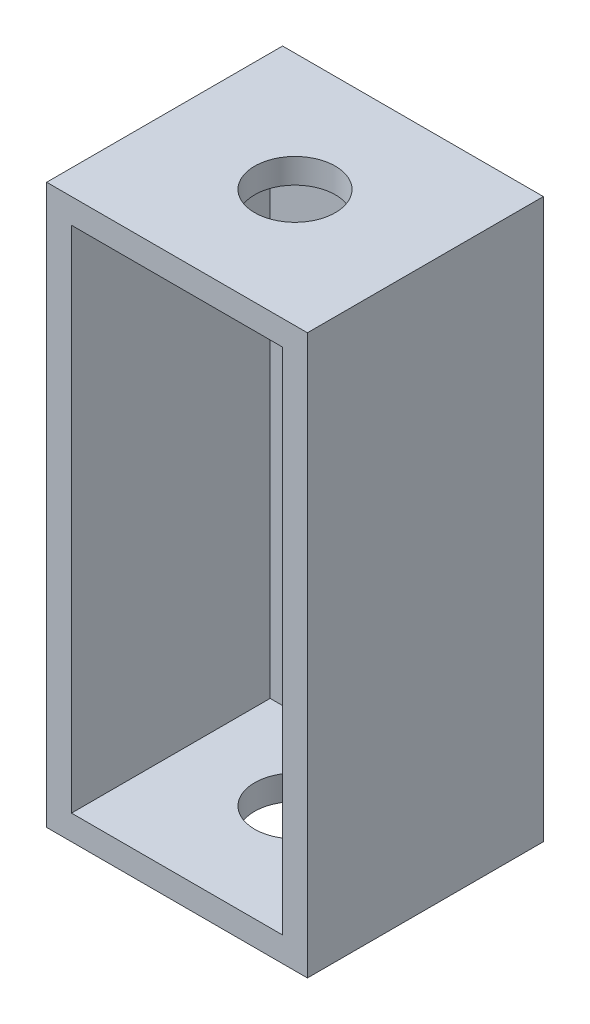
ISO-10303-21;
HEADER;
FILE_DESCRIPTION(('STEP AP214'),'2;1');
FILE_NAME('part.step','',(''),(''),'','','');
FILE_SCHEMA(('AUTOMOTIVE_DESIGN { 1 0 10303 214 1 1 1 1 }'));
ENDSEC;
DATA;
#1=APPLICATION_CONTEXT('core data for automotive mechanical design processes');
#2=APPLICATION_PROTOCOL_DEFINITION('international standard','automotive_design',2000,#1);
#3=PRODUCT_CONTEXT('',#1,'mechanical');
#4=PRODUCT('Part','Part','',(#3));
#5=PRODUCT_RELATED_PRODUCT_CATEGORY('part','',(#4));
#6=PRODUCT_DEFINITION_FORMATION('','',#4);
#7=PRODUCT_DEFINITION_CONTEXT('part definition',#1,'design');
#8=PRODUCT_DEFINITION('design','',#6,#7);
#9=PRODUCT_DEFINITION_SHAPE('','',#8);
#10=(LENGTH_UNIT() NAMED_UNIT(*) SI_UNIT(.MILLI.,.METRE.));
#11=(NAMED_UNIT(*) PLANE_ANGLE_UNIT() SI_UNIT($,.RADIAN.));
#12=(NAMED_UNIT(*) SI_UNIT($,.STERADIAN.) SOLID_ANGLE_UNIT());
#13=UNCERTAINTY_MEASURE_WITH_UNIT(LENGTH_MEASURE(1.E-05),#10,'distance_accuracy_value','');
#14=(GEOMETRIC_REPRESENTATION_CONTEXT(3) GLOBAL_UNCERTAINTY_ASSIGNED_CONTEXT((#13)) GLOBAL_UNIT_ASSIGNED_CONTEXT((#10,
#11,#12)) REPRESENTATION_CONTEXT('',''));
#15=CARTESIAN_POINT('',(0.,0.,0.));
#16=DIRECTION('',(0.,0.,1.));
#17=DIRECTION('',(1.,0.,0.));
#18=AXIS2_PLACEMENT_3D('',#15,#16,#17);
#19=CARTESIAN_POINT('',(0.,90.,38.));
#20=DIRECTION('',(1.,0.,0.));
#21=DIRECTION('',(0.,0.,-1.));
#22=AXIS2_PLACEMENT_3D('',#19,#20,#21);
#23=PLANE('',#22);
#24=DIRECTION('',(0.,-1.,0.));
#25=VECTOR('',#24,1.);
#26=CARTESIAN_POINT('',(0.,90.,0.));
#27=LINE('',#26,#25);
#28=CARTESIAN_POINT('',(0.,90.,0.));
#29=VERTEX_POINT('',#28);
#30=CARTESIAN_POINT('',(0.,0.,0.));
#31=VERTEX_POINT('',#30);
#32=EDGE_CURVE('E151',#29,#31,#27,.T.);
#33=ORIENTED_EDGE('',*,*,#32,.T.);
#34=DIRECTION('',(0.,0.,-1.));
#35=VECTOR('',#34,1.);
#36=CARTESIAN_POINT('',(0.,0.,38.));
#37=LINE('',#36,#35);
#38=CARTESIAN_POINT('',(0.,0.,38.));
#39=VERTEX_POINT('',#38);
#40=EDGE_CURVE('E11',#39,#31,#37,.T.);
#41=ORIENTED_EDGE('',*,*,#40,.F.);
#42=DIRECTION('',(0.,-1.,0.));
#43=VECTOR('',#42,1.);
#44=CARTESIAN_POINT('',(0.,90.,38.));
#45=LINE('',#44,#43);
#46=CARTESIAN_POINT('',(0.,90.,38.));
#47=VERTEX_POINT('',#46);
#48=EDGE_CURVE('E155',#47,#39,#45,.T.);
#49=ORIENTED_EDGE('',*,*,#48,.F.);
#50=DIRECTION('',(0.,0.,-1.));
#51=VECTOR('',#50,1.);
#52=CARTESIAN_POINT('',(0.,90.,38.));
#53=LINE('',#52,#51);
#54=EDGE_CURVE('E161',#47,#29,#53,.T.);
#55=ORIENTED_EDGE('',*,*,#54,.T.);
#56=EDGE_LOOP('',(#33,#41,#49,#55));
#57=FACE_BOUND('',#56,.T.);
#58=ADVANCED_FACE('F39',(#57),#23,.F.);
#59=CARTESIAN_POINT('',(0.,0.,38.));
#60=DIRECTION('',(0.,1.,0.));
#61=DIRECTION('',(0.,0.,1.));
#62=AXIS2_PLACEMENT_3D('',#59,#60,#61);
#63=PLANE('',#62);
#64=CARTESIAN_POINT('',(21.,0.,19.));
#65=DIRECTION('',(0.,1.,0.));
#66=DIRECTION('',(0.,0.,1.));
#67=AXIS2_PLACEMENT_3D('',#64,#65,#66);
#68=CIRCLE('',#67,6.5);
#69=CARTESIAN_POINT('',(21.,0.,25.5));
#70=VERTEX_POINT('',#69);
#71=EDGE_CURVE('E208',#70,#70,#68,.T.);
#72=ORIENTED_EDGE('',*,*,#71,.T.);
#73=EDGE_LOOP('',(#72));
#74=FACE_BOUND('',#73,.T.);
#75=DIRECTION('',(1.,0.,0.));
#76=VECTOR('',#75,1.);
#77=CARTESIAN_POINT('',(0.,0.,0.));
#78=LINE('',#77,#76);
#79=CARTESIAN_POINT('',(42.,0.,0.));
#80=VERTEX_POINT('',#79);
#81=EDGE_CURVE('E164',#31,#80,#78,.T.);
#82=ORIENTED_EDGE('',*,*,#81,.T.);
#83=DIRECTION('',(0.,0.,-1.));
#84=VECTOR('',#83,1.);
#85=CARTESIAN_POINT('',(42.,0.,38.));
#86=LINE('',#85,#84);
#87=CARTESIAN_POINT('',(42.,0.,38.));
#88=VERTEX_POINT('',#87);
#89=EDGE_CURVE('E47',#88,#80,#86,.T.);
#90=ORIENTED_EDGE('',*,*,#89,.F.);
#91=DIRECTION('',(1.,0.,0.));
#92=VECTOR('',#91,1.);
#93=CARTESIAN_POINT('',(0.,0.,38.));
#94=LINE('',#93,#92);
#95=EDGE_CURVE('E91',#39,#88,#94,.T.);
#96=ORIENTED_EDGE('',*,*,#95,.F.);
#97=ORIENTED_EDGE('',*,*,#40,.T.);
#98=EDGE_LOOP('',(#82,#90,#96,#97));
#99=FACE_BOUND('',#98,.T.);
#100=ADVANCED_FACE('F195',(#74,#99),#63,.F.);
#101=CARTESIAN_POINT('',(42.,0.,38.));
#102=DIRECTION('',(-1.,0.,0.));
#103=DIRECTION('',(0.,0.,1.));
#104=AXIS2_PLACEMENT_3D('',#101,#102,#103);
#105=PLANE('',#104);
#106=DIRECTION('',(0.,1.,0.));
#107=VECTOR('',#106,1.);
#108=CARTESIAN_POINT('',(42.,0.,0.));
#109=LINE('',#108,#107);
#110=CARTESIAN_POINT('',(42.,90.,0.));
#111=VERTEX_POINT('',#110);
#112=EDGE_CURVE('E166',#80,#111,#109,.T.);
#113=ORIENTED_EDGE('',*,*,#112,.T.);
#114=DIRECTION('',(0.,0.,-1.));
#115=VECTOR('',#114,1.);
#116=CARTESIAN_POINT('',(42.,90.,38.));
#117=LINE('',#116,#115);
#118=CARTESIAN_POINT('',(42.,90.,38.));
#119=VERTEX_POINT('',#118);
#120=EDGE_CURVE('E170',#119,#111,#117,.T.);
#121=ORIENTED_EDGE('',*,*,#120,.F.);
#122=DIRECTION('',(0.,1.,0.));
#123=VECTOR('',#122,1.);
#124=CARTESIAN_POINT('',(42.,0.,38.));
#125=LINE('',#124,#123);
#126=EDGE_CURVE('E158',#88,#119,#125,.T.);
#127=ORIENTED_EDGE('',*,*,#126,.F.);
#128=ORIENTED_EDGE('',*,*,#89,.T.);
#129=EDGE_LOOP('',(#113,#121,#127,#128));
#130=FACE_BOUND('',#129,.T.);
#131=ADVANCED_FACE('F176',(#130),#105,.F.);
#132=CARTESIAN_POINT('',(42.,90.,38.));
#133=DIRECTION('',(0.,-1.,0.));
#134=DIRECTION('',(0.,0.,-1.));
#135=AXIS2_PLACEMENT_3D('',#132,#133,#134);
#136=PLANE('',#135);
#137=CARTESIAN_POINT('',(21.,90.,19.));
#138=DIRECTION('',(0.,1.,0.));
#139=DIRECTION('',(0.,0.,1.));
#140=AXIS2_PLACEMENT_3D('',#137,#138,#139);
#141=CIRCLE('',#140,6.5);
#142=CARTESIAN_POINT('',(21.,90.,25.5));
#143=VERTEX_POINT('',#142);
#144=EDGE_CURVE('E210',#143,#143,#141,.T.);
#145=ORIENTED_EDGE('',*,*,#144,.F.);
#146=EDGE_LOOP('',(#145));
#147=FACE_BOUND('',#146,.T.);
#148=DIRECTION('',(-1.,0.,0.));
#149=VECTOR('',#148,1.);
#150=CARTESIAN_POINT('',(42.,90.,0.));
#151=LINE('',#150,#149);
#152=EDGE_CURVE('E84',#111,#29,#151,.T.);
#153=ORIENTED_EDGE('',*,*,#152,.T.);
#154=ORIENTED_EDGE('',*,*,#54,.F.);
#155=DIRECTION('',(-1.,0.,0.));
#156=VECTOR('',#155,1.);
#157=CARTESIAN_POINT('',(42.,90.,38.));
#158=LINE('',#157,#156);
#159=EDGE_CURVE('E63',#119,#47,#158,.T.);
#160=ORIENTED_EDGE('',*,*,#159,.F.);
#161=ORIENTED_EDGE('',*,*,#120,.T.);
#162=EDGE_LOOP('',(#153,#154,#160,#161));
#163=FACE_BOUND('',#162,.T.);
#164=ADVANCED_FACE('F184',(#147,#163),#136,.F.);
#165=CARTESIAN_POINT('',(0.,0.,38.));
#166=DIRECTION('',(0.,0.,1.));
#167=DIRECTION('',(1.,0.,0.));
#168=AXIS2_PLACEMENT_3D('',#165,#166,#167);
#169=PLANE('',#168);
#170=DIRECTION('',(0.,-1.,0.));
#171=VECTOR('',#170,1.);
#172=CARTESIAN_POINT('',(4.,86.,38.));
#173=LINE('',#172,#171);
#174=CARTESIAN_POINT('',(4.,86.,38.));
#175=VERTEX_POINT('',#174);
#176=CARTESIAN_POINT('',(4.,4.,38.));
#177=VERTEX_POINT('',#176);
#178=EDGE_CURVE('E54',#175,#177,#173,.T.);
#179=ORIENTED_EDGE('',*,*,#178,.F.);
#180=DIRECTION('',(-1.,0.,0.));
#181=VECTOR('',#180,1.);
#182=CARTESIAN_POINT('',(38.,86.,38.));
#183=LINE('',#182,#181);
#184=CARTESIAN_POINT('',(38.,86.,38.));
#185=VERTEX_POINT('',#184);
#186=EDGE_CURVE('E133',#185,#175,#183,.T.);
#187=ORIENTED_EDGE('',*,*,#186,.F.);
#188=DIRECTION('',(0.,1.,0.));
#189=VECTOR('',#188,1.);
#190=CARTESIAN_POINT('',(38.,4.,38.));
#191=LINE('',#190,#189);
#192=CARTESIAN_POINT('',(38.,4.,38.));
#193=VERTEX_POINT('',#192);
#194=EDGE_CURVE('E136',#193,#185,#191,.T.);
#195=ORIENTED_EDGE('',*,*,#194,.F.);
#196=DIRECTION('',(1.,0.,0.));
#197=VECTOR('',#196,1.);
#198=CARTESIAN_POINT('',(4.,4.,38.));
#199=LINE('',#198,#197);
#200=EDGE_CURVE('E145',#177,#193,#199,.T.);
#201=ORIENTED_EDGE('',*,*,#200,.F.);
#202=EDGE_LOOP('',(#179,#187,#195,#201));
#203=FACE_BOUND('',#202,.T.);
#204=ORIENTED_EDGE('',*,*,#48,.T.);
#205=ORIENTED_EDGE('',*,*,#95,.T.);
#206=ORIENTED_EDGE('',*,*,#126,.T.);
#207=ORIENTED_EDGE('',*,*,#159,.T.);
#208=EDGE_LOOP('',(#204,#205,#206,#207));
#209=FACE_BOUND('',#208,.T.);
#210=ADVANCED_FACE('F186',(#203,#209),#169,.T.);
#211=CARTESIAN_POINT('',(0.,0.,0.));
#212=DIRECTION('',(0.,0.,1.));
#213=DIRECTION('',(1.,0.,0.));
#214=AXIS2_PLACEMENT_3D('',#211,#212,#213);
#215=PLANE('',#214);
#216=ORIENTED_EDGE('',*,*,#32,.F.);
#217=ORIENTED_EDGE('',*,*,#152,.F.);
#218=ORIENTED_EDGE('',*,*,#112,.F.);
#219=ORIENTED_EDGE('',*,*,#81,.F.);
#220=EDGE_LOOP('',(#216,#217,#218,#219));
#221=FACE_BOUND('',#220,.T.);
#222=ADVANCED_FACE('F180',(#221),#215,.F.);
#223=CARTESIAN_POINT('',(4.,86.,6.));
#224=DIRECTION('',(-1.,0.,0.));
#225=DIRECTION('',(0.,0.,1.));
#226=AXIS2_PLACEMENT_3D('',#223,#224,#225);
#227=PLANE('',#226);
#228=ORIENTED_EDGE('',*,*,#178,.T.);
#229=DIRECTION('',(0.,0.,1.));
#230=VECTOR('',#229,1.);
#231=CARTESIAN_POINT('',(4.,4.,6.));
#232=LINE('',#231,#230);
#233=CARTESIAN_POINT('',(4.,4.,6.));
#234=VERTEX_POINT('',#233);
#235=EDGE_CURVE('E111',#234,#177,#232,.T.);
#236=ORIENTED_EDGE('',*,*,#235,.F.);
#237=DIRECTION('',(0.,-1.,0.));
#238=VECTOR('',#237,1.);
#239=CARTESIAN_POINT('',(4.,86.,6.));
#240=LINE('',#239,#238);
#241=CARTESIAN_POINT('',(4.,86.,6.));
#242=VERTEX_POINT('',#241);
#243=EDGE_CURVE('E115',#242,#234,#240,.T.);
#244=ORIENTED_EDGE('',*,*,#243,.F.);
#245=DIRECTION('',(0.,0.,1.));
#246=VECTOR('',#245,1.);
#247=CARTESIAN_POINT('',(4.,86.,6.));
#248=LINE('',#247,#246);
#249=EDGE_CURVE('E149',#242,#175,#248,.T.);
#250=ORIENTED_EDGE('',*,*,#249,.T.);
#251=EDGE_LOOP('',(#228,#236,#244,#250));
#252=FACE_BOUND('',#251,.T.);
#253=ADVANCED_FACE('F113',(#252),#227,.F.);
#254=CARTESIAN_POINT('',(38.,86.,6.));
#255=DIRECTION('',(0.,1.,0.));
#256=DIRECTION('',(0.,0.,1.));
#257=AXIS2_PLACEMENT_3D('',#254,#255,#256);
#258=PLANE('',#257);
#259=CARTESIAN_POINT('',(21.,86.,19.));
#260=DIRECTION('',(0.,1.,0.));
#261=DIRECTION('',(0.,0.,1.));
#262=AXIS2_PLACEMENT_3D('',#259,#260,#261);
#263=CIRCLE('',#262,6.5);
#264=CARTESIAN_POINT('',(21.,86.,25.5));
#265=VERTEX_POINT('',#264);
#266=EDGE_CURVE('E139',#265,#265,#263,.T.);
#267=ORIENTED_EDGE('',*,*,#266,.T.);
#268=EDGE_LOOP('',(#267));
#269=FACE_BOUND('',#268,.T.);
#270=ORIENTED_EDGE('',*,*,#186,.T.);
#271=ORIENTED_EDGE('',*,*,#249,.F.);
#272=DIRECTION('',(-1.,0.,0.));
#273=VECTOR('',#272,1.);
#274=CARTESIAN_POINT('',(38.,86.,6.));
#275=LINE('',#274,#273);
#276=CARTESIAN_POINT('',(38.,86.,6.));
#277=VERTEX_POINT('',#276);
#278=EDGE_CURVE('E121',#277,#242,#275,.T.);
#279=ORIENTED_EDGE('',*,*,#278,.F.);
#280=DIRECTION('',(0.,0.,1.));
#281=VECTOR('',#280,1.);
#282=CARTESIAN_POINT('',(38.,86.,6.));
#283=LINE('',#282,#281);
#284=EDGE_CURVE('E152',#277,#185,#283,.T.);
#285=ORIENTED_EDGE('',*,*,#284,.T.);
#286=EDGE_LOOP('',(#270,#271,#279,#285));
#287=FACE_BOUND('',#286,.T.);
#288=ADVANCED_FACE('F223',(#269,#287),#258,.F.);
#289=CARTESIAN_POINT('',(38.,4.,6.));
#290=DIRECTION('',(1.,0.,0.));
#291=DIRECTION('',(0.,0.,-1.));
#292=AXIS2_PLACEMENT_3D('',#289,#290,#291);
#293=PLANE('',#292);
#294=ORIENTED_EDGE('',*,*,#194,.T.);
#295=ORIENTED_EDGE('',*,*,#284,.F.);
#296=DIRECTION('',(0.,1.,0.));
#297=VECTOR('',#296,1.);
#298=CARTESIAN_POINT('',(38.,4.,6.));
#299=LINE('',#298,#297);
#300=CARTESIAN_POINT('',(38.,4.,6.));
#301=VERTEX_POINT('',#300);
#302=EDGE_CURVE('E129',#301,#277,#299,.T.);
#303=ORIENTED_EDGE('',*,*,#302,.F.);
#304=DIRECTION('',(0.,0.,1.));
#305=VECTOR('',#304,1.);
#306=CARTESIAN_POINT('',(38.,4.,6.));
#307=LINE('',#306,#305);
#308=EDGE_CURVE('E120',#301,#193,#307,.T.);
#309=ORIENTED_EDGE('',*,*,#308,.T.);
#310=EDGE_LOOP('',(#294,#295,#303,#309));
#311=FACE_BOUND('',#310,.T.);
#312=ADVANCED_FACE('F226',(#311),#293,.F.);
#313=CARTESIAN_POINT('',(4.,4.,6.));
#314=DIRECTION('',(0.,-1.,0.));
#315=DIRECTION('',(0.,0.,-1.));
#316=AXIS2_PLACEMENT_3D('',#313,#314,#315);
#317=PLANE('',#316);
#318=CARTESIAN_POINT('',(21.,4.,19.));
#319=DIRECTION('',(0.,-1.,0.));
#320=DIRECTION('',(0.,0.,-1.));
#321=AXIS2_PLACEMENT_3D('',#318,#319,#320);
#322=CIRCLE('',#321,6.5);
#323=CARTESIAN_POINT('',(21.,4.,25.5));
#324=VERTEX_POINT('',#323);
#325=EDGE_CURVE('E42',#324,#324,#322,.T.);
#326=ORIENTED_EDGE('',*,*,#325,.T.);
#327=EDGE_LOOP('',(#326));
#328=FACE_BOUND('',#327,.T.);
#329=ORIENTED_EDGE('',*,*,#200,.T.);
#330=ORIENTED_EDGE('',*,*,#308,.F.);
#331=DIRECTION('',(1.,0.,0.));
#332=VECTOR('',#331,1.);
#333=CARTESIAN_POINT('',(4.,4.,6.));
#334=LINE('',#333,#332);
#335=EDGE_CURVE('E124',#234,#301,#334,.T.);
#336=ORIENTED_EDGE('',*,*,#335,.F.);
#337=ORIENTED_EDGE('',*,*,#235,.T.);
#338=EDGE_LOOP('',(#329,#330,#336,#337));
#339=FACE_BOUND('',#338,.T.);
#340=ADVANCED_FACE('F125',(#328,#339),#317,.F.);
#341=CARTESIAN_POINT('',(0.,0.,6.));
#342=DIRECTION('',(0.,0.,1.));
#343=DIRECTION('',(1.,0.,0.));
#344=AXIS2_PLACEMENT_3D('',#341,#342,#343);
#345=PLANE('',#344);
#346=ORIENTED_EDGE('',*,*,#243,.T.);
#347=ORIENTED_EDGE('',*,*,#335,.T.);
#348=ORIENTED_EDGE('',*,*,#302,.T.);
#349=ORIENTED_EDGE('',*,*,#278,.T.);
#350=EDGE_LOOP('',(#346,#347,#348,#349));
#351=FACE_BOUND('',#350,.T.);
#352=ADVANCED_FACE('F131',(#351),#345,.T.);
#353=CARTESIAN_POINT('',(21.,0.,19.));
#354=DIRECTION('',(0.,1.,0.));
#355=DIRECTION('',(0.,0.,1.));
#356=AXIS2_PLACEMENT_3D('',#353,#354,#355);
#357=CYLINDRICAL_SURFACE('',#356,6.5);
#358=CARTESIAN_POINT('',(21.,0.,25.5));
#359=CARTESIAN_POINT('',(21.,0.0416666666666667,25.5));
#360=CARTESIAN_POINT('',(21.,0.0833333333333333,25.5));
#361=CARTESIAN_POINT('',(21.,0.166666666666667,25.5));
#362=CARTESIAN_POINT('',(21.,0.208333333333333,25.5));
#363=CARTESIAN_POINT('',(21.,0.291666666666667,25.5));
#364=CARTESIAN_POINT('',(21.,0.333333333333333,25.5));
#365=CARTESIAN_POINT('',(21.,0.416666666666667,25.5));
#366=CARTESIAN_POINT('',(21.,0.458333333333333,25.5));
#367=CARTESIAN_POINT('',(21.,0.541666666666667,25.5));
#368=CARTESIAN_POINT('',(21.,0.583333333333333,25.5));
#369=CARTESIAN_POINT('',(21.,0.666666666666667,25.5));
#370=CARTESIAN_POINT('',(21.,0.708333333333334,25.5));
#371=CARTESIAN_POINT('',(21.,0.791666666666667,25.5));
#372=CARTESIAN_POINT('',(21.,0.833333333333334,25.5));
#373=CARTESIAN_POINT('',(21.,0.916666666666667,25.5));
#374=CARTESIAN_POINT('',(21.,0.958333333333334,25.5));
#375=CARTESIAN_POINT('',(21.,1.04166666666667,25.5));
#376=CARTESIAN_POINT('',(21.,1.08333333333333,25.5));
#377=CARTESIAN_POINT('',(21.,1.16666666666667,25.5));
#378=CARTESIAN_POINT('',(21.,1.20833333333333,25.5));
#379=CARTESIAN_POINT('',(21.,1.29166666666667,25.5));
#380=CARTESIAN_POINT('',(21.,1.33333333333333,25.5));
#381=CARTESIAN_POINT('',(21.,1.41666666666667,25.5));
#382=CARTESIAN_POINT('',(21.,1.45833333333333,25.5));
#383=CARTESIAN_POINT('',(21.,1.54166666666667,25.5));
#384=CARTESIAN_POINT('',(21.,1.58333333333333,25.5));
#385=CARTESIAN_POINT('',(21.,1.66666666666667,25.5));
#386=CARTESIAN_POINT('',(21.,1.70833333333333,25.5));
#387=CARTESIAN_POINT('',(21.,1.79166666666667,25.5));
#388=CARTESIAN_POINT('',(21.,1.83333333333333,25.5));
#389=CARTESIAN_POINT('',(21.,1.91666666666667,25.5));
#390=CARTESIAN_POINT('',(21.,1.95833333333333,25.5));
#391=CARTESIAN_POINT('',(21.,2.04166666666667,25.5));
#392=CARTESIAN_POINT('',(21.,2.08333333333333,25.5));
#393=CARTESIAN_POINT('',(21.,2.16666666666667,25.5));
#394=CARTESIAN_POINT('',(21.,2.20833333333333,25.5));
#395=CARTESIAN_POINT('',(21.,2.29166666666667,25.5));
#396=CARTESIAN_POINT('',(21.,2.33333333333333,25.5));
#397=CARTESIAN_POINT('',(21.,2.41666666666667,25.5));
#398=CARTESIAN_POINT('',(21.,2.45833333333333,25.5));
#399=CARTESIAN_POINT('',(21.,2.54166666666667,25.5));
#400=CARTESIAN_POINT('',(21.,2.58333333333333,25.5));
#401=CARTESIAN_POINT('',(21.,2.66666666666667,25.5));
#402=CARTESIAN_POINT('',(21.,2.70833333333333,25.5));
#403=CARTESIAN_POINT('',(21.,2.79166666666667,25.5));
#404=CARTESIAN_POINT('',(21.,2.83333333333333,25.5));
#405=CARTESIAN_POINT('',(21.,2.91666666666667,25.5));
#406=CARTESIAN_POINT('',(21.,2.95833333333333,25.5));
#407=CARTESIAN_POINT('',(21.,3.04166666666667,25.5));
#408=CARTESIAN_POINT('',(21.,3.08333333333333,25.5));
#409=CARTESIAN_POINT('',(21.,3.16666666666667,25.5));
#410=CARTESIAN_POINT('',(21.,3.20833333333333,25.5));
#411=CARTESIAN_POINT('',(21.,3.29166666666667,25.5));
#412=CARTESIAN_POINT('',(21.,3.33333333333333,25.5));
#413=CARTESIAN_POINT('',(21.,3.41666666666667,25.5));
#414=CARTESIAN_POINT('',(21.,3.45833333333333,25.5));
#415=CARTESIAN_POINT('',(21.,3.54166666666667,25.5));
#416=CARTESIAN_POINT('',(21.,3.58333333333333,25.5));
#417=CARTESIAN_POINT('',(21.,3.66666666666667,25.5));
#418=CARTESIAN_POINT('',(21.,3.70833333333333,25.5));
#419=CARTESIAN_POINT('',(21.,3.79166666666667,25.5));
#420=CARTESIAN_POINT('',(21.,3.83333333333333,25.5));
#421=CARTESIAN_POINT('',(21.,3.91666666666667,25.5));
#422=CARTESIAN_POINT('',(21.,3.95833333333333,25.5));
#423=CARTESIAN_POINT('',(21.,4.,25.5));
#424=B_SPLINE_CURVE_WITH_KNOTS('',3,(#358,#359,#360,#361,#362,#363,#364,#365,#366,#367,#368,
#369,#370,#371,#372,#373,#374,#375,#376,#377,#378,#379,#380,#381,#382,#383,#384,#385,#386,#387,
#388,#389,#390,#391,#392,#393,#394,#395,#396,#397,#398,#399,#400,#401,#402,#403,#404,#405,#406,
#407,#408,#409,#410,#411,#412,#413,#414,#415,#416,#417,#418,#419,#420,#421,#422,#423),
.UNSPECIFIED.,.F.,.F.,(4,2,2,2,2,2,2,2,2,2,2,2,2,2,2,2,2,2,2,2,2,2,2,2,2,2,2,2,2,2,2,2,4),(0.,
0.125,0.25,0.375,0.5,0.625,0.75,0.875,1.,1.125,1.25,1.375,1.5,1.625,1.75,1.875,2.,2.125,2.25,
2.375,2.5,2.625,2.75,2.875,3.,3.125,3.25,3.375,3.5,3.625,3.75,3.875,4.),.UNSPECIFIED.);
#425=EDGE_CURVE('BSEAM218',#70,#324,#424,.T.);
#426=ORIENTED_EDGE('',*,*,#71,.F.);
#427=ORIENTED_EDGE('',*,*,#325,.F.);
#428=ORIENTED_EDGE('',*,*,#425,.T.);
#429=ORIENTED_EDGE('',*,*,#425,.F.);
#430=EDGE_LOOP('',(#426,#428,#427,#429));
#431=FACE_BOUND('',#430,.T.);
#432=ADVANCED_FACE('F218',(#431),#357,.F.);
#433=CARTESIAN_POINT('',(21.,90.,25.5));
#434=CARTESIAN_POINT('',(21.,89.9583333333333,25.5));
#435=CARTESIAN_POINT('',(21.,89.9166666666666,25.5));
#436=CARTESIAN_POINT('',(21.,89.8333333333333,25.5));
#437=CARTESIAN_POINT('',(21.,89.7916666666666,25.5));
#438=CARTESIAN_POINT('',(21.,89.7083333333333,25.5));
#439=CARTESIAN_POINT('',(21.,89.6666666666666,25.5));
#440=CARTESIAN_POINT('',(21.,89.5833333333333,25.5));
#441=CARTESIAN_POINT('',(21.,89.5416666666666,25.5));
#442=CARTESIAN_POINT('',(21.,89.4583333333333,25.5));
#443=CARTESIAN_POINT('',(21.,89.4166666666666,25.5));
#444=CARTESIAN_POINT('',(21.,89.3333333333333,25.5));
#445=CARTESIAN_POINT('',(21.,89.2916666666666,25.5));
#446=CARTESIAN_POINT('',(21.,89.2083333333333,25.5));
#447=CARTESIAN_POINT('',(21.,89.1666666666666,25.5));
#448=CARTESIAN_POINT('',(21.,89.0833333333333,25.5));
#449=CARTESIAN_POINT('',(21.,89.0416666666666,25.5));
#450=CARTESIAN_POINT('',(21.,88.9583333333333,25.5));
#451=CARTESIAN_POINT('',(21.,88.9166666666666,25.5));
#452=CARTESIAN_POINT('',(21.,88.8333333333333,25.5));
#453=CARTESIAN_POINT('',(21.,88.7916666666666,25.5));
#454=CARTESIAN_POINT('',(21.,88.7083333333333,25.5));
#455=CARTESIAN_POINT('',(21.,88.6666666666666,25.5));
#456=CARTESIAN_POINT('',(21.,88.5833333333333,25.5));
#457=CARTESIAN_POINT('',(21.,88.5416666666666,25.5));
#458=CARTESIAN_POINT('',(21.,88.4583333333333,25.5));
#459=CARTESIAN_POINT('',(21.,88.4166666666666,25.5));
#460=CARTESIAN_POINT('',(21.,88.3333333333333,25.5));
#461=CARTESIAN_POINT('',(21.,88.2916666666666,25.5));
#462=CARTESIAN_POINT('',(21.,88.2083333333333,25.5));
#463=CARTESIAN_POINT('',(21.,88.1666666666666,25.5));
#464=CARTESIAN_POINT('',(21.,88.0833333333333,25.5));
#465=CARTESIAN_POINT('',(21.,88.0416666666666,25.5));
#466=CARTESIAN_POINT('',(21.,87.9583333333333,25.5));
#467=CARTESIAN_POINT('',(21.,87.9166666666666,25.5));
#468=CARTESIAN_POINT('',(21.,87.8333333333333,25.5));
#469=CARTESIAN_POINT('',(21.,87.7916666666666,25.5));
#470=CARTESIAN_POINT('',(21.,87.7083333333333,25.5));
#471=CARTESIAN_POINT('',(21.,87.6666666666666,25.5));
#472=CARTESIAN_POINT('',(21.,87.5833333333333,25.5));
#473=CARTESIAN_POINT('',(21.,87.5416666666666,25.5));
#474=CARTESIAN_POINT('',(21.,87.4583333333333,25.5));
#475=CARTESIAN_POINT('',(21.,87.4166666666666,25.5));
#476=CARTESIAN_POINT('',(21.,87.3333333333333,25.5));
#477=CARTESIAN_POINT('',(21.,87.2916666666666,25.5));
#478=CARTESIAN_POINT('',(21.,87.2083333333333,25.5));
#479=CARTESIAN_POINT('',(21.,87.1666666666666,25.5));
#480=CARTESIAN_POINT('',(21.,87.0833333333333,25.5));
#481=CARTESIAN_POINT('',(21.,87.0416666666666,25.5));
#482=CARTESIAN_POINT('',(21.,86.9583333333333,25.5));
#483=CARTESIAN_POINT('',(21.,86.9166666666666,25.5));
#484=CARTESIAN_POINT('',(21.,86.8333333333333,25.5));
#485=CARTESIAN_POINT('',(21.,86.7916666666666,25.5));
#486=CARTESIAN_POINT('',(21.,86.7083333333333,25.5));
#487=CARTESIAN_POINT('',(21.,86.6666666666666,25.5));
#488=CARTESIAN_POINT('',(21.,86.5833333333333,25.5));
#489=CARTESIAN_POINT('',(21.,86.5416666666666,25.5));
#490=CARTESIAN_POINT('',(21.,86.4583333333333,25.5));
#491=CARTESIAN_POINT('',(21.,86.4166666666666,25.5));
#492=CARTESIAN_POINT('',(21.,86.3333333333333,25.5));
#493=CARTESIAN_POINT('',(21.,86.2916666666666,25.5));
#494=CARTESIAN_POINT('',(21.,86.2083333333333,25.5));
#495=CARTESIAN_POINT('',(21.,86.1666666666666,25.5));
#496=CARTESIAN_POINT('',(21.,86.0833333333333,25.5));
#497=CARTESIAN_POINT('',(21.,86.0416666666666,25.5));
#498=CARTESIAN_POINT('',(21.,86.,25.5));
#499=B_SPLINE_CURVE_WITH_KNOTS('',3,(#433,#434,#435,#436,#437,#438,#439,#440,#441,#442,#443,
#444,#445,#446,#447,#448,#449,#450,#451,#452,#453,#454,#455,#456,#457,#458,#459,#460,#461,#462,
#463,#464,#465,#466,#467,#468,#469,#470,#471,#472,#473,#474,#475,#476,#477,#478,#479,#480,#481,
#482,#483,#484,#485,#486,#487,#488,#489,#490,#491,#492,#493,#494,#495,#496,#497,#498),
.UNSPECIFIED.,.F.,.F.,(4,2,2,2,2,2,2,2,2,2,2,2,2,2,2,2,2,2,2,2,2,2,2,2,2,2,2,2,2,2,2,2,4),(0.,
0.125,0.25,0.375,0.5,0.625000000000001,0.750000000000001,0.875000000000001,1.,1.125,1.25,1.375,
1.5,1.625,1.75,1.875,2.,2.125,2.25,2.375,2.5,2.625,2.75,2.875,3.,3.125,3.25,3.375,3.5,3.625,
3.75,3.875,4.),.UNSPECIFIED.);
#500=EDGE_CURVE('BSEAM215',#143,#265,#499,.T.);
#501=ORIENTED_EDGE('',*,*,#144,.T.);
#502=ORIENTED_EDGE('',*,*,#266,.F.);
#503=ORIENTED_EDGE('',*,*,#500,.T.);
#504=ORIENTED_EDGE('',*,*,#500,.F.);
#505=EDGE_LOOP('',(#501,#503,#502,#504));
#506=FACE_BOUND('',#505,.T.);
#507=ADVANCED_FACE('F215',(#506),#357,.F.);
#508=CLOSED_SHELL('',(#58,#100,#131,#164,#210,#222,#253,#288,#312,#340,#352,#432,#507));
#509=MANIFOLD_SOLID_BREP('B2',#508);
#510=ADVANCED_BREP_SHAPE_REPRESENTATION('',(#18,#509),#14);
#511=SHAPE_DEFINITION_REPRESENTATION(#9,#510);
ENDSEC;
END-ISO-10303-21;
